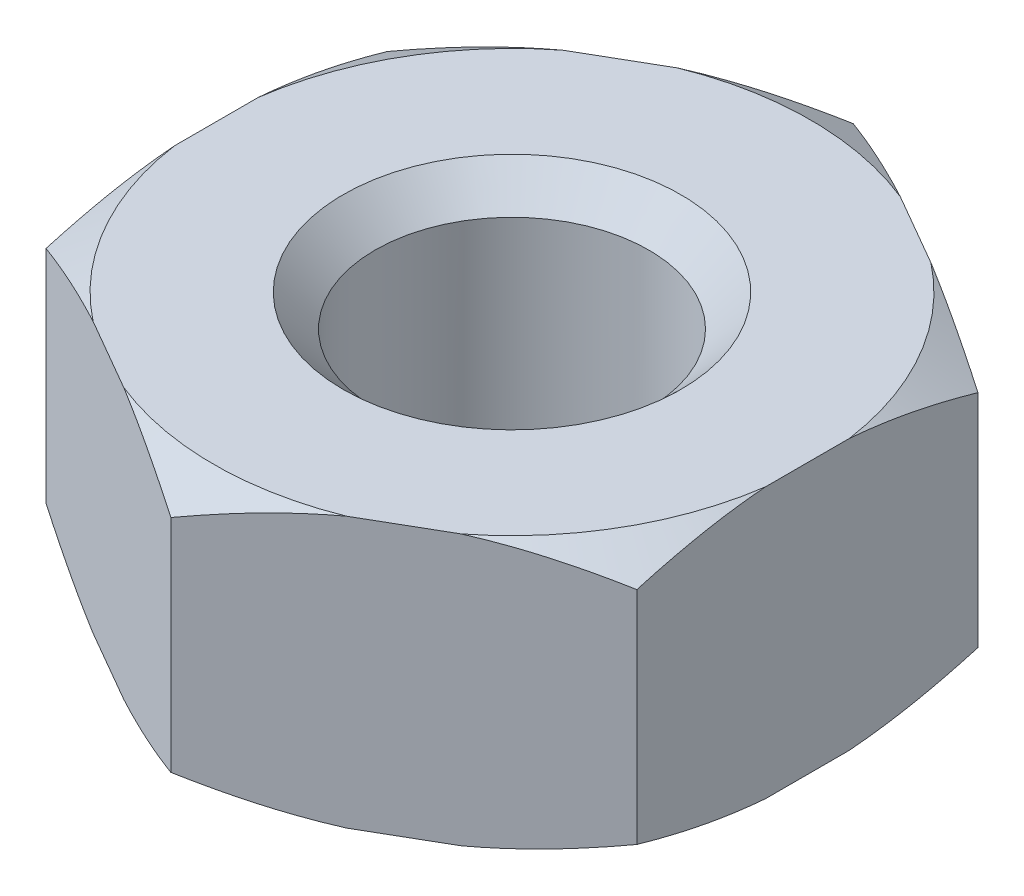
ISO-10303-21;
HEADER;
FILE_DESCRIPTION(('STEP AP214'),'2;1');
FILE_NAME('part.step','',(''),(''),'','','');
FILE_SCHEMA(('AUTOMOTIVE_DESIGN { 1 0 10303 214 1 1 1 1 }'));
ENDSEC;
DATA;
#1=APPLICATION_CONTEXT('core data for automotive mechanical design processes');
#2=APPLICATION_PROTOCOL_DEFINITION('international standard','automotive_design',2000,#1);
#3=PRODUCT_CONTEXT('',#1,'mechanical');
#4=PRODUCT('Part','Part','',(#3));
#5=PRODUCT_RELATED_PRODUCT_CATEGORY('part','',(#4));
#6=PRODUCT_DEFINITION_FORMATION('','',#4);
#7=PRODUCT_DEFINITION_CONTEXT('part definition',#1,'design');
#8=PRODUCT_DEFINITION('design','',#6,#7);
#9=PRODUCT_DEFINITION_SHAPE('','',#8);
#10=(LENGTH_UNIT() NAMED_UNIT(*) SI_UNIT(.MILLI.,.METRE.));
#11=(NAMED_UNIT(*) PLANE_ANGLE_UNIT() SI_UNIT($,.RADIAN.));
#12=(NAMED_UNIT(*) SI_UNIT($,.STERADIAN.) SOLID_ANGLE_UNIT());
#13=UNCERTAINTY_MEASURE_WITH_UNIT(LENGTH_MEASURE(1.E-05),#10,'distance_accuracy_value','');
#14=(GEOMETRIC_REPRESENTATION_CONTEXT(3) GLOBAL_UNCERTAINTY_ASSIGNED_CONTEXT((#13)) GLOBAL_UNIT_ASSIGNED_CONTEXT((#10,
#11,#12)) REPRESENTATION_CONTEXT('',''));
#15=CARTESIAN_POINT('',(0.,0.,0.));
#16=DIRECTION('',(0.,0.,1.));
#17=DIRECTION('',(1.,0.,0.));
#18=AXIS2_PLACEMENT_3D('',#15,#16,#17);
#19=CARTESIAN_POINT('',(14.9999999999998,89.594158762111,30.9807621135335));
#20=DIRECTION('',(0.,1.,0.));
#21=DIRECTION('',(0.,0.,1.));
#22=AXIS2_PLACEMENT_3D('',#19,#20,#21);
#23=CONICAL_SURFACE('',#22,4.04449792147054,1.04719755122789);
#24=CARTESIAN_POINT('',(14.9999996255523,89.5924002565624,26.9393100130187));
#25=CARTESIAN_POINT('',(15.1079034852909,89.5564400899679,27.0016083354854));
#26=CARTESIAN_POINT('',(15.2164124104834,89.5227578619408,27.0642559926547));
#27=CARTESIAN_POINT('',(15.4343175488654,89.4609646511426,27.1900635829574));
#28=CARTESIAN_POINT('',(15.5437108336706,89.432839830139,27.2532218253872));
#29=CARTESIAN_POINT('',(15.7636624980717,89.3829733342438,27.3802109780379));
#30=CARTESIAN_POINT('',(15.8742214410188,89.3612349075061,27.4440422135097));
#31=CARTESIAN_POINT('',(16.0965006385664,89.3249619438303,27.572375168049));
#32=CARTESIAN_POINT('',(16.208223122392,89.3104457571025,27.6368781741603));
#33=CARTESIAN_POINT('',(16.3202724710333,89.2999996732793,27.7015698957609));
#34=B_SPLINE_CURVE_WITH_KNOTS('',3,(#24,#25,#26,#27,#28,#29,#30,#31,#32,#33),.UNSPECIFIED.,.F.,
.F.,(4,2,2,2,4),(0.,0.389082876202713,0.777184356642125,1.16548288716278,1.55476302847786),.UNSPECIFIED.);
#35=CARTESIAN_POINT('',(14.9999998127762,89.5924001941544,26.9393101211125));
#36=VERTEX_POINT('',#35);
#37=CARTESIAN_POINT('',(16.3202728778975,89.2999996352051,27.7015701306641));
#38=VERTEX_POINT('',#37);
#39=EDGE_CURVE('E152',#36,#38,#34,.T.);
#40=ORIENTED_EDGE('',*,*,#39,.T.);
#41=CARTESIAN_POINT('',(14.9999999999998,89.2999995971309,30.9807621135335));
#42=DIRECTION('',(0.,1.,0.));
#43=DIRECTION('',(0.,0.,1.));
#44=AXIS2_PLACEMENT_3D('',#41,#42,#43);
#45=CIRCLE('',#44,3.53499930217615);
#46=CARTESIAN_POINT('',(13.6797271221022,89.2999996352051,27.7015701306641));
#47=VERTEX_POINT('',#46);
#48=EDGE_CURVE('E154',#47,#38,#45,.F.);
#49=ORIENTED_EDGE('',*,*,#48,.F.);
#50=CARTESIAN_POINT('',(13.6797275289663,89.2999996732793,27.701569895761));
#51=CARTESIAN_POINT('',(13.7917768715689,89.3104457565444,27.6368781776469));
#52=CARTESIAN_POINT('',(13.9034993493964,89.32496194227,27.5723751749986));
#53=CARTESIAN_POINT('',(14.1257785350938,89.3612349032082,27.444042227301));
#54=CARTESIAN_POINT('',(14.2363374721885,89.3829733282139,27.3802109952081));
#55=CARTESIAN_POINT('',(14.4562891250316,89.4328398200611,27.2532218492304));
#56=CARTESIAN_POINT('',(14.5656824041311,89.4609646387498,27.1900636100948));
#57=CARTESIAN_POINT('',(14.7835875311933,89.5227578444655,27.0642560263276));
#58=CARTESIAN_POINT('',(14.8920964507722,89.5564400697229,27.0016083723992));
#59=CARTESIAN_POINT('',(15.0000003049579,89.5924002333992,26.9393100531386));
#60=B_SPLINE_CURVE_WITH_KNOTS('',3,(#50,#51,#52,#53,#54,#55,#56,#57,#58,#59),.UNSPECIFIED.,.F.,
.F.,(4,2,2,2,4),(0.,0.389280120356007,0.777578630048175,1.16568008969993,1.55476294498455),.UNSPECIFIED.);
#61=EDGE_CURVE('E21',#47,#36,#60,.T.);
#62=ORIENTED_EDGE('',*,*,#61,.T.);
#63=EDGE_LOOP('',(#40,#49,#62));
#64=FACE_BOUND('',#63,.T.);
#65=ADVANCED_FACE('F17',(#64),#23,.T.);
#66=CARTESIAN_POINT('',(14.9999999999998,89.594158762111,30.9807621135335));
#67=DIRECTION('',(0.,1.,0.));
#68=DIRECTION('',(0.,0.,1.));
#69=AXIS2_PLACEMENT_3D('',#66,#67,#68);
#70=CONICAL_SURFACE('',#69,4.04449792147054,1.04719755122789);
#71=CARTESIAN_POINT('',(18.4999999999998,89.5924002565614,28.9600357389985));
#72=CARTESIAN_POINT('',(18.4999999999998,89.5564400897345,29.0846323847375));
#73=CARTESIAN_POINT('',(18.4999999999998,89.5227578615043,29.2099276998914));
#74=CARTESIAN_POINT('',(18.4999999999998,89.4609646503785,29.461542882137));
#75=CARTESIAN_POINT('',(18.4999999999998,89.43283982925,29.5878593678216));
#76=CARTESIAN_POINT('',(18.4999999999998,89.3829733331993,29.8418376747895));
#77=CARTESIAN_POINT('',(18.4999999999998,89.3612349064311,29.9695001465748));
#78=CARTESIAN_POINT('',(18.4999999999998,89.324961942802,30.2261660573509));
#79=CARTESIAN_POINT('',(18.4999999999998,89.3104457561519,30.3551720704295));
#80=CARTESIAN_POINT('',(18.4999999999998,89.2999996724683,30.4845555144862));
#81=B_SPLINE_CURVE_WITH_KNOTS('',3,(#71,#72,#73,#74,#75,#76,#77,#78,#79,#80),.UNSPECIFIED.,.F.,
.F.,(4,2,2,2,4),(0.,0.389082878719323,0.777184361653166,1.16548289467336,1.55476303851014),.UNSPECIFIED.);
#82=CARTESIAN_POINT('',(18.4999999999998,89.5924001941539,28.9600359551843));
#83=VERTEX_POINT('',#82);
#84=CARTESIAN_POINT('',(18.4999999999998,89.2999996347925,30.4845559793772));
#85=VERTEX_POINT('',#84);
#86=EDGE_CURVE('E415',#83,#85,#81,.T.);
#87=ORIENTED_EDGE('',*,*,#86,.T.);
#88=CARTESIAN_POINT('',(14.9999999999998,89.2999995971309,30.9807621135335));
#89=DIRECTION('',(0.,1.,0.));
#90=DIRECTION('',(0.,0.,1.));
#91=AXIS2_PLACEMENT_3D('',#88,#89,#90);
#92=CIRCLE('',#91,3.53499930217615);
#93=CARTESIAN_POINT('',(17.179727122102,89.2999996352051,28.1977762699117));
#94=VERTEX_POINT('',#93);
#95=EDGE_CURVE('E186',#94,#85,#92,.F.);
#96=ORIENTED_EDGE('',*,*,#95,.F.);
#97=CARTESIAN_POINT('',(17.1797275289663,89.2999996732793,28.1977765048149));
#98=CARTESIAN_POINT('',(17.2917768715691,89.3104457565445,28.2624682229292));
#99=CARTESIAN_POINT('',(17.403499349397,89.3249619422701,28.3269712255776));
#100=CARTESIAN_POINT('',(17.6257785350948,89.3612349032085,28.4553041732755));
#101=CARTESIAN_POINT('',(17.7363374721898,89.3829733282142,28.5191354053686));
#102=CARTESIAN_POINT('',(17.9562891250333,89.4328398200616,28.6461245513465));
#103=CARTESIAN_POINT('',(18.0656824041331,89.4609646387503,28.7092827904823));
#104=CARTESIAN_POINT('',(18.2835875311958,89.5227578444663,28.8350903742497));
#105=CARTESIAN_POINT('',(18.3920964507749,89.5564400697238,28.8977380281782));
#106=CARTESIAN_POINT('',(18.5000003049608,89.5924002334002,28.9600363474391));
#107=B_SPLINE_CURVE_WITH_KNOTS('',3,(#97,#98,#99,#100,#101,#102,#103,#104,#105,#106),
.UNSPECIFIED.,.F.,.F.,(4,2,2,2,4),(0.,0.3892801203569,0.77757863004996,1.16568008970261,
1.55476294498812),.UNSPECIFIED.);
#108=EDGE_CURVE('E420',#94,#83,#107,.T.);
#109=ORIENTED_EDGE('',*,*,#108,.T.);
#110=EDGE_LOOP('',(#87,#96,#109));
#111=FACE_BOUND('',#110,.T.);
#112=ADVANCED_FACE('F406',(#111),#70,.T.);
#113=CARTESIAN_POINT('',(14.9999999999998,89.5941587620541,30.9807621135335));
#114=DIRECTION('',(0.,1.,0.));
#115=DIRECTION('',(0.,0.,1.));
#116=AXIS2_PLACEMENT_3D('',#113,#114,#115);
#117=CONICAL_SURFACE('',#116,4.04449792138374,1.04719755117958);
#118=CARTESIAN_POINT('',(18.499999998484,89.2999996732925,31.476968712333));
#119=CARTESIAN_POINT('',(18.4999999994531,89.3104457420079,31.6063519764103));
#120=CARTESIAN_POINT('',(18.4999999998528,89.3249619025469,31.7353578106814));
#121=CARTESIAN_POINT('',(18.5000000001465,89.3612347953169,31.9920233681568));
#122=CARTESIAN_POINT('',(18.5000000000417,89.3829731774212,32.1196856654355));
#123=CARTESIAN_POINT('',(18.4999999999579,89.4328395689953,32.373663627768));
#124=CARTESIAN_POINT('',(18.4999999999788,89.4609643303312,32.4999799433193));
#125=CARTESIAN_POINT('',(18.5000000000208,89.5227574101921,32.7515947880351));
#126=CARTESIAN_POINT('',(18.5000000000419,89.5564395668933,32.8768899358091));
#127=CARTESIAN_POINT('',(18.4999999999998,89.5923996583918,33.0014864159717));
#128=B_SPLINE_CURVE_WITH_KNOTS('',3,(#118,#119,#120,#121,#122,#123,#124,#125,#126,#127),
.UNSPECIFIED.,.F.,.F.,(4,2,2,2,4),(0.,0.389279602662558,0.777577597854176,1.16567854397863,
1.55476088254271),.UNSPECIFIED.);
#129=CARTESIAN_POINT('',(18.4999999999998,89.2999996347443,31.4769682475828));
#130=VERTEX_POINT('',#129);
#131=CARTESIAN_POINT('',(18.5000000553264,89.5923999135079,33.0014872038917));
#132=VERTEX_POINT('',#131);
#133=EDGE_CURVE('E410',#130,#132,#128,.T.);
#134=ORIENTED_EDGE('',*,*,#133,.T.);
#135=CARTESIAN_POINT('',(17.1797275289671,89.2999996732398,33.7637477222515));
#136=CARTESIAN_POINT('',(17.2917768546849,89.3104457549461,33.6990560138858));
#137=CARTESIAN_POINT('',(17.4034993157409,89.3249619378708,33.6345530209206));
#138=CARTESIAN_POINT('',(17.6257784683034,89.3612348911584,33.5062200923534));
#139=CARTESIAN_POINT('',(17.7363373890334,89.3829733113233,33.4423888697086));
#140=CARTESIAN_POINT('',(17.9562890095579,89.4328397918575,33.3153997423901));
#141=CARTESIAN_POINT('',(18.065682272703,89.4609646040759,33.2522415124657));
#142=CARTESIAN_POINT('',(18.2835873681123,89.5227577955868,33.1264339469734));
#143=CARTESIAN_POINT('',(18.3920962719941,89.5564400131035,33.0637863021078));
#144=CARTESIAN_POINT('',(18.5000001106521,89.5924001686237,33.001487991812));
#145=B_SPLINE_CURVE_WITH_KNOTS('',3,(#135,#136,#137,#138,#139,#140,#141,#142,#143,#144),
.UNSPECIFIED.,.F.,.F.,(4,2,2,2,4),(0.,0.389280061751958,0.777578513204977,1.16567991473175,
1.55476271152684),.UNSPECIFIED.);
#146=CARTESIAN_POINT('',(17.1797271220103,89.2999996351569,33.7637479572081));
#147=VERTEX_POINT('',#146);
#148=EDGE_CURVE('E393',#147,#132,#145,.T.);
#149=ORIENTED_EDGE('',*,*,#148,.F.);
#150=CARTESIAN_POINT('',(14.9999999999998,89.299999597074,30.9807621135335));
#151=DIRECTION('',(0.,1.,0.));
#152=DIRECTION('',(0.,0.,1.));
#153=AXIS2_PLACEMENT_3D('',#150,#151,#152);
#154=CIRCLE('',#153,3.53499930214619);
#155=EDGE_CURVE('E184',#130,#147,#154,.F.);
#156=ORIENTED_EDGE('',*,*,#155,.F.);
#157=EDGE_LOOP('',(#134,#149,#156));
#158=FACE_BOUND('',#157,.T.);
#159=ADVANCED_FACE('F403',(#158),#117,.T.);
#160=CARTESIAN_POINT('',(14.9999999999998,89.5941587620541,30.9807621135335));
#161=DIRECTION('',(0.,1.,0.));
#162=DIRECTION('',(0.,0.,1.));
#163=AXIS2_PLACEMENT_3D('',#160,#161,#162);
#164=CONICAL_SURFACE('',#163,4.04449792138374,1.04719755117958);
#165=CARTESIAN_POINT('',(14.9999994151093,89.5923999367761,35.0222136601742));
#166=CARTESIAN_POINT('',(14.8920956313348,89.5564398102326,34.9599153815654));
#167=CARTESIAN_POINT('',(14.7835867829349,89.522757620235,34.8972677687323));
#168=CARTESIAN_POINT('',(14.5656817994087,89.4609644792686,34.7714602678356));
#169=CARTESIAN_POINT('',(14.456288592659,89.4328396900974,34.7083020704712));
#170=CARTESIAN_POINT('',(14.2363370863788,89.3829732499244,34.5813130091117));
#171=CARTESIAN_POINT('',(14.1257782234992,89.3612348470655,34.5174818198668));
#172=CARTESIAN_POINT('',(13.9034991880782,89.3249619212263,34.3891489589313));
#173=CARTESIAN_POINT('',(13.7917767863178,89.3104457484111,34.3246460002004));
#174=CARTESIAN_POINT('',(13.6797275203016,89.2999996724289,34.2599543263035));
#175=B_SPLINE_CURVE_WITH_KNOTS('',3,(#165,#166,#167,#168,#169,#170,#171,#172,#173,#174),
.UNSPECIFIED.,.F.,.F.,(4,2,2,2,4),(0.,0.389082589936093,0.777183785887369,1.16548203136116,
1.55476188584912),.UNSPECIFIED.);
#176=CARTESIAN_POINT('',(14.9999999999998,89.5923999367763,35.0222136601745));
#177=VERTEX_POINT('',#176);
#178=CARTESIAN_POINT('',(13.6797271176003,89.2999996347443,34.2599540938037));
#179=VERTEX_POINT('',#178);
#180=EDGE_CURVE('E283',#177,#179,#175,.T.);
#181=ORIENTED_EDGE('',*,*,#180,.T.);
#182=CARTESIAN_POINT('',(14.9999999999998,89.299999597074,30.9807621135335));
#183=DIRECTION('',(0.,1.,0.));
#184=DIRECTION('',(0.,0.,1.));
#185=AXIS2_PLACEMENT_3D('',#182,#183,#184);
#186=CIRCLE('',#185,3.53499930214619);
#187=CARTESIAN_POINT('',(16.320272877989,89.2999996351569,34.25995409635));
#188=VERTEX_POINT('',#187);
#189=EDGE_CURVE('E183',#188,#179,#186,.F.);
#190=ORIENTED_EDGE('',*,*,#189,.F.);
#191=CARTESIAN_POINT('',(15.0000005848903,89.5923999367761,35.0222136601741));
#192=CARTESIAN_POINT('',(15.1079043679669,89.5564398104651,34.9599153819683));
#193=CARTESIAN_POINT('',(15.2164132156606,89.5227576206707,34.8972677695429));
#194=CARTESIAN_POINT('',(15.4343181977659,89.4609644800321,34.7714602694666));
#195=CARTESIAN_POINT('',(15.5437114038008,89.4328396909859,34.7083020725148));
#196=CARTESIAN_POINT('',(15.7636629086374,89.3829732509685,34.5813130119888));
#197=CARTESIAN_POINT('',(15.874221770788,89.3612348481402,34.5174818231648));
#198=CARTESIAN_POINT('',(16.0965008047384,89.3249619222543,34.3891489630783));
#199=CARTESIAN_POINT('',(16.2082232057573,89.3104457493615,34.3246460047756));
#200=CARTESIAN_POINT('',(16.3202724710323,89.2999996732398,34.2599543313066));
#201=B_SPLINE_CURVE_WITH_KNOTS('',3,(#191,#192,#193,#194,#195,#196,#197,#198,#199,#200),
.UNSPECIFIED.,.F.,.F.,(4,2,2,2,4),(0.,0.389082587418711,0.777183780874786,1.16548202384827,
1.55476187581376),.UNSPECIFIED.);
#202=EDGE_CURVE('E399',#177,#188,#201,.T.);
#203=ORIENTED_EDGE('',*,*,#202,.F.);
#204=EDGE_LOOP('',(#181,#190,#203));
#205=FACE_BOUND('',#204,.T.);
#206=ADVANCED_FACE('F266',(#205),#164,.T.);
#207=CARTESIAN_POINT('',(14.9999999999998,89.5941587620541,30.9807621135335));
#208=DIRECTION('',(0.,1.,0.));
#209=DIRECTION('',(0.,0.,1.));
#210=AXIS2_PLACEMENT_3D('',#207,#208,#209);
#211=CONICAL_SURFACE('',#210,4.04449792138374,1.04719755117958);
#212=CARTESIAN_POINT('',(11.4999999999998,89.5924002565429,33.0014884880285));
#213=CARTESIAN_POINT('',(11.4999999999998,89.5564400899462,32.8768918430991));
#214=CARTESIAN_POINT('',(11.4999999999998,89.5227578619169,32.7515965287643));
#215=CARTESIAN_POINT('',(11.4999999999998,89.4609646511146,32.4999813481665));
#216=CARTESIAN_POINT('',(11.4999999999998,89.432839830109,32.3736648633106));
#217=CARTESIAN_POINT('',(11.4999999999998,89.3829733342105,32.1196865580164));
#218=CARTESIAN_POINT('',(11.4999999999998,89.3612349074712,31.9920240870762));
#219=CARTESIAN_POINT('',(11.4999999999998,89.3249619437927,31.7353581780044));
#220=CARTESIAN_POINT('',(11.4999999999998,89.3104457570637,31.6063521657852));
#221=CARTESIAN_POINT('',(11.4999999999998,89.2999996732397,31.4769687225873));
#222=B_SPLINE_CURVE_WITH_KNOTS('',3,(#212,#213,#214,#215,#216,#217,#218,#219,#220,#221),
.UNSPECIFIED.,.F.,.F.,(4,2,2,2,4),(0.,0.389082876193206,0.777184356622985,1.16548288713404,
1.55476302843963),.UNSPECIFIED.);
#223=CARTESIAN_POINT('',(11.4999999999998,89.5924001941412,33.0014882718627));
#224=VERTEX_POINT('',#223);
#225=CARTESIAN_POINT('',(11.4999999999998,89.2999996351569,31.4769682526744));
#226=VERTEX_POINT('',#225);
#227=EDGE_CURVE('E271',#224,#226,#222,.T.);
#228=ORIENTED_EDGE('',*,*,#227,.T.);
#229=CARTESIAN_POINT('',(14.9999999999998,89.299999597074,30.9807621135335));
#230=DIRECTION('',(0.,1.,0.));
#231=DIRECTION('',(0.,0.,1.));
#232=AXIS2_PLACEMENT_3D('',#229,#230,#231);
#233=CIRCLE('',#232,3.53499930214619);
#234=CARTESIAN_POINT('',(12.8202728823993,89.2999996347443,33.7637479597543));
#235=VERTEX_POINT('',#234);
#236=EDGE_CURVE('E179',#235,#226,#233,.F.);
#237=ORIENTED_EDGE('',*,*,#236,.F.);
#238=CARTESIAN_POINT('',(12.8202724806718,89.2999996732925,33.7637477260665));
#239=CARTESIAN_POINT('',(12.7082231367733,89.3104457558578,33.6990560083232));
#240=CARTESIAN_POINT('',(12.5965006579661,89.3249619412759,33.6345530055708));
#241=CARTESIAN_POINT('',(12.3742214706108,89.3612349020022,33.5062200572551));
#242=CARTESIAN_POINT('',(12.2636625328371,89.3829733271015,33.4423888246492));
#243=CARTESIAN_POINT('',(12.0437108785909,89.4328398191574,33.3153996777647));
#244=CARTESIAN_POINT('',(11.9343175987672,89.4609646379603,33.2522414382351));
#245=CARTESIAN_POINT('',(11.7164124702588,89.5227578439847,33.1264338536815));
#246=CARTESIAN_POINT('',(11.6079035499581,89.5564400694373,33.0637861993607));
#247=CARTESIAN_POINT('',(11.4999996950941,89.5924002333748,33.0014878796598));
#248=B_SPLINE_CURVE_WITH_KNOTS('',3,(#238,#239,#240,#241,#242,#243,#244,#245,#246,#247),
.UNSPECIFIED.,.F.,.F.,(4,2,2,2,4),(0.,0.389280122933855,0.777578635155598,1.16568009729628,
1.55476295511462),.UNSPECIFIED.);
#249=EDGE_CURVE('E276',#235,#224,#248,.T.);
#250=ORIENTED_EDGE('',*,*,#249,.T.);
#251=EDGE_LOOP('',(#228,#237,#250));
#252=FACE_BOUND('',#251,.T.);
#253=ADVANCED_FACE('F258',(#252),#211,.T.);
#254=CARTESIAN_POINT('',(14.9999999999998,89.594158762111,30.9807621135335));
#255=DIRECTION('',(0.,1.,0.));
#256=DIRECTION('',(0.,0.,1.));
#257=AXIS2_PLACEMENT_3D('',#254,#255,#256);
#258=CONICAL_SURFACE('',#257,4.04449792147054,1.04719755122789);
#259=CARTESIAN_POINT('',(11.4999999999998,89.2999996732793,30.4845555044795));
#260=CARTESIAN_POINT('',(11.4999999999998,89.3104457565443,30.3551720682534));
#261=CARTESIAN_POINT('',(11.4999999999998,89.3249619422695,30.2261660629591));
#262=CARTESIAN_POINT('',(11.4999999999998,89.3612349032069,29.9695001675682));
#263=CARTESIAN_POINT('',(11.4999999999998,89.382973328212,29.8418377033845));
#264=CARTESIAN_POINT('',(11.4999999999998,89.4328398200579,29.5878594114334));
#265=CARTESIAN_POINT('',(11.4999999999998,89.4609646387458,29.4615429331642));
#266=CARTESIAN_POINT('',(11.4999999999998,89.5227578444599,29.2099277656341));
#267=CARTESIAN_POINT('',(11.4999999999998,89.5564400697165,29.0846324577794));
#268=CARTESIAN_POINT('',(11.4999999999998,89.5924002333919,28.9600358192601));
#269=B_SPLINE_CURVE_WITH_KNOTS('',3,(#259,#260,#261,#262,#263,#264,#265,#266,#267,#268),
.UNSPECIFIED.,.F.,.F.,(4,2,2,2,4),(0.,0.389280120349326,0.777578630034866,1.16568008968,
1.55476294495795),.UNSPECIFIED.);
#270=CARTESIAN_POINT('',(11.4999999999998,89.2999996352051,30.4845559742858));
#271=VERTEX_POINT('',#270);
#272=CARTESIAN_POINT('',(11.4999998127906,89.5924001941496,28.9600362794551));
#273=VERTEX_POINT('',#272);
#274=EDGE_CURVE('E242',#271,#273,#269,.T.);
#275=ORIENTED_EDGE('',*,*,#274,.T.);
#276=CARTESIAN_POINT('',(11.4999996255812,89.5924002565527,28.9600363875406));
#277=CARTESIAN_POINT('',(11.6079034853174,89.5564400899595,28.8977380650752));
#278=CARTESIAN_POINT('',(11.7164124105076,89.5227578619335,28.8350904079072));
#279=CARTESIAN_POINT('',(11.9343175488849,89.4609646511374,28.7092828176073));
#280=CARTESIAN_POINT('',(12.0437108336877,89.4328398301347,28.6461245751788));
#281=CARTESIAN_POINT('',(12.263662498084,89.3829733342412,28.5191354225309));
#282=CARTESIAN_POINT('',(12.3742214410287,89.3612349075043,28.4553041870605));
#283=CARTESIAN_POINT('',(12.5965006385713,89.3249619438295,28.326971232524));
#284=CARTESIAN_POINT('',(12.7082231223945,89.3104457571022,28.2624682264141));
#285=CARTESIAN_POINT('',(12.8202724710332,89.2999996732793,28.1977765048151));
#286=B_SPLINE_CURVE_WITH_KNOTS('',3,(#276,#277,#278,#279,#280,#281,#282,#283,#284,#285),
.UNSPECIFIED.,.F.,.F.,(4,2,2,2,4),(0.,0.38908287619402,0.777184356624805,1.16548288713682,
1.55476302844319),.UNSPECIFIED.);
#287=CARTESIAN_POINT('',(12.8202728778974,89.2999996352051,28.1977762699119));
#288=VERTEX_POINT('',#287);
#289=EDGE_CURVE('E234',#273,#288,#286,.T.);
#290=ORIENTED_EDGE('',*,*,#289,.T.);
#291=CARTESIAN_POINT('',(14.9999999999998,89.2999995971309,30.9807621135335));
#292=DIRECTION('',(0.,1.,0.));
#293=DIRECTION('',(0.,0.,1.));
#294=AXIS2_PLACEMENT_3D('',#291,#292,#293);
#295=CIRCLE('',#294,3.53499930217615);
#296=EDGE_CURVE('E166',#271,#288,#295,.F.);
#297=ORIENTED_EDGE('',*,*,#296,.F.);
#298=EDGE_LOOP('',(#275,#290,#297));
#299=FACE_BOUND('',#298,.T.);
#300=ADVANCED_FACE('F253',(#299),#258,.T.);
#301=CARTESIAN_POINT('',(18.5349999999998,92.540414518845,32.9812807962755));
#302=DIRECTION('',(0.5,0.,0.866025403784439));
#303=DIRECTION('',(0.866025403784439,0.,-0.5));
#304=AXIS2_PLACEMENT_3D('',#301,#302,#303);
#305=PLANE('',#304);
#306=CARTESIAN_POINT('',(18.4999981130779,92.2076004972439,33.001489145112));
#307=CARTESIAN_POINT('',(18.3920944333498,92.2435605691086,33.0637873636496));
#308=CARTESIAN_POINT('',(18.2835856901324,92.2772427072112,33.1264349157555));
#309=CARTESIAN_POINT('',(18.0656809187072,92.3390357529464,33.2522422941956));
#310=CARTESIAN_POINT('',(17.9562878188658,92.3671604987402,33.3154004298366));
#311=CARTESIAN_POINT('',(17.7363365291495,92.4170268630672,33.4423893661628));
#312=CARTESIAN_POINT('',(17.6257777759285,92.4387652334726,33.5062204920962));
#313=CARTESIAN_POINT('',(17.4034989625452,92.4750381080168,33.6345532248383));
#314=CARTESIAN_POINT('',(17.2917766731721,92.4895542620527,33.6990561186823));
#315=CARTESIAN_POINT('',(17.1797275203028,92.5000003275807,33.7637477272539));
#316=B_SPLINE_CURVE_WITH_KNOTS('',3,(#306,#307,#308,#309,#310,#311,#312,#313,#314,#315),
.UNSPECIFIED.,.F.,.F.,(4,2,2,2,4),(0.,0.38908219799076,0.777183004440866,1.16548085964814,
1.55476032142311),.UNSPECIFIED.);
#317=CARTESIAN_POINT('',(18.4999990565398,92.2076001827567,33.001488600404));
#318=VERTEX_POINT('',#317);
#319=CARTESIAN_POINT('',(17.1797254891048,92.5000005176591,33.7637488999665));
#320=VERTEX_POINT('',#319);
#321=EDGE_CURVE('E188',#318,#320,#316,.T.);
#322=ORIENTED_EDGE('',*,*,#321,.T.);
#323=DIRECTION('',(0.866025403784439,0.,-0.5));
#324=VECTOR('',#323,1.);
#325=CARTESIAN_POINT('',(18.5349999999998,92.5000006323826,32.9812807962755));
#326=LINE('',#325,#324);
#327=CARTESIAN_POINT('',(16.3202728823985,92.5000003652654,34.2599540938042));
#328=VERTEX_POINT('',#327);
#329=EDGE_CURVE('E160',#320,#328,#326,.F.);
#330=ORIENTED_EDGE('',*,*,#329,.T.);
#331=CARTESIAN_POINT('',(16.3202724791555,92.5000003267184,34.2599543248688));
#332=CARTESIAN_POINT('',(16.2082233266958,92.4895542617508,34.3246459343213));
#333=CARTESIAN_POINT('',(16.0965010374799,92.4750381079452,34.3891488285355));
#334=CARTESIAN_POINT('',(15.874222224194,92.4387652335682,34.5174815615598));
#335=CARTESIAN_POINT('',(15.763663470914,92.417026863101,34.5813126874065));
#336=CARTESIAN_POINT('',(15.5437121811457,92.3671604987236,34.7083016236663));
#337=CARTESIAN_POINT('',(15.4343190813112,92.3390357529419,34.7714597593273));
#338=CARTESIAN_POINT('',(15.2164143098935,92.2772427072286,34.8972671378114));
#339=CARTESIAN_POINT('',(15.1079055666769,92.2435605691358,34.9599146899413));
#340=CARTESIAN_POINT('',(15.0000018869217,92.2076004972439,35.022212908446));
#341=B_SPLINE_CURVE_WITH_KNOTS('',3,(#331,#332,#333,#334,#335,#336,#337,#338,#339,#340),
.UNSPECIFIED.,.F.,.F.,(4,2,2,2,4),(0.,0.389279461844505,0.777577317095368,1.16567812355356,
1.55476032157491),.UNSPECIFIED.);
#342=CARTESIAN_POINT('',(14.9999999999998,92.2076004972432,35.022212908447));
#343=VERTEX_POINT('',#342);
#344=EDGE_CURVE('E241',#328,#343,#341,.T.);
#345=ORIENTED_EDGE('',*,*,#344,.T.);
#346=DIRECTION('',(0.,1.,0.));
#347=VECTOR('',#346,1.);
#348=CARTESIAN_POINT('',(14.9999999999998,92.540414518845,35.0222139978608));
#349=LINE('',#348,#347);
#350=EDGE_CURVE('E317',#177,#343,#349,.T.);
#351=ORIENTED_EDGE('',*,*,#350,.F.);
#352=ORIENTED_EDGE('',*,*,#202,.T.);
#353=DIRECTION('',(-0.866025403784467,0.,0.499999999999951));
#354=VECTOR('',#353,1.);
#355=CARTESIAN_POINT('',(17.1797275326647,89.3000000000017,33.7637477201167));
#356=LINE('',#355,#354);
#357=EDGE_CURVE('E180',#147,#188,#356,.T.);
#358=ORIENTED_EDGE('',*,*,#357,.F.);
#359=ORIENTED_EDGE('',*,*,#148,.T.);
#360=DIRECTION('',(0.,-1.,0.));
#361=VECTOR('',#360,1.);
#362=CARTESIAN_POINT('',(18.4999999999998,92.5404145188449,33.0014880556971));
#363=LINE('',#362,#361);
#364=EDGE_CURVE('E170',#318,#132,#363,.T.);
#365=ORIENTED_EDGE('',*,*,#364,.F.);
#366=EDGE_LOOP('',(#322,#330,#345,#351,#352,#358,#359,#365));
#367=FACE_BOUND('',#366,.T.);
#368=ADVANCED_FACE('F257',(#367),#305,.T.);
#369=CARTESIAN_POINT('',(11.4191709623132,89.3000000000017,35.1030430355474));
#370=DIRECTION('',(0.,-1.,0.));
#371=DIRECTION('',(0.,0.,-1.));
#372=AXIS2_PLACEMENT_3D('',#369,#370,#371);
#373=PLANE('',#372);
#374=ORIENTED_EDGE('',*,*,#296,.T.);
#375=DIRECTION('',(0.86602540378444,0.,-0.499999999999998));
#376=VECTOR('',#375,1.);
#377=CARTESIAN_POINT('',(12.8202724673348,89.3000000000017,28.1977765069503));
#378=LINE('',#377,#376);
#379=EDGE_CURVE('E147',#288,#47,#378,.T.);
#380=ORIENTED_EDGE('',*,*,#379,.T.);
#381=ORIENTED_EDGE('',*,*,#48,.T.);
#382=DIRECTION('',(0.866025403784442,0.,0.499999999999995));
#383=VECTOR('',#382,1.);
#384=CARTESIAN_POINT('',(16.3202724673348,89.3000000000017,27.7015698936256));
#385=LINE('',#384,#383);
#386=EDGE_CURVE('E159',#38,#94,#385,.T.);
#387=ORIENTED_EDGE('',*,*,#386,.T.);
#388=ORIENTED_EDGE('',*,*,#95,.T.);
#389=DIRECTION('',(0.,0.,-1.));
#390=VECTOR('',#389,1.);
#391=CARTESIAN_POINT('',(18.4999999999998,89.2999993676207,28.9196216525265));
#392=LINE('',#391,#390);
#393=EDGE_CURVE('E176',#130,#85,#392,.T.);
#394=ORIENTED_EDGE('',*,*,#393,.F.);
#395=ORIENTED_EDGE('',*,*,#155,.T.);
#396=ORIENTED_EDGE('',*,*,#357,.T.);
#397=ORIENTED_EDGE('',*,*,#189,.T.);
#398=DIRECTION('',(0.866025403784439,0.,0.499999999999999));
#399=VECTOR('',#398,1.);
#400=CARTESIAN_POINT('',(15.0349999999998,89.2999993676207,35.0424212572825));
#401=LINE('',#400,#399);
#402=EDGE_CURVE('E315',#235,#179,#401,.T.);
#403=ORIENTED_EDGE('',*,*,#402,.F.);
#404=ORIENTED_EDGE('',*,*,#236,.T.);
#405=DIRECTION('',(0.,0.,-1.));
#406=VECTOR('',#405,1.);
#407=CARTESIAN_POINT('',(11.4999999999998,89.3000000000017,35.1030430355474));
#408=LINE('',#407,#406);
#409=EDGE_CURVE('E172',#226,#271,#408,.T.);
#410=ORIENTED_EDGE('',*,*,#409,.T.);
#411=EDGE_LOOP('',(#374,#380,#381,#387,#388,#394,#395,#396,#397,#403,#404,#410));
#412=FACE_BOUND('',#411,.T.);
#413=CARTESIAN_POINT('',(14.9999999999998,89.2999999999802,30.9807621135335));
#414=DIRECTION('',(0.,-1.,0.));
#415=DIRECTION('',(0.,0.,-1.));
#416=AXIS2_PLACEMENT_3D('',#413,#414,#415);
#417=CIRCLE('',#416,1.99999999999611);
#418=CARTESIAN_POINT('',(14.9999999999998,89.2999999999802,28.9807621135374));
#419=VERTEX_POINT('',#418);
#420=EDGE_CURVE('E373',#419,#419,#417,.F.);
#421=ORIENTED_EDGE('',*,*,#420,.T.);
#422=EDGE_LOOP('',(#421));
#423=FACE_BOUND('',#422,.T.);
#424=ADVANCED_FACE('F162',(#412,#423),#373,.T.);
#425=CARTESIAN_POINT('',(18.4999999999998,92.5404145188449,28.9196216525265));
#426=DIRECTION('',(1.,0.,0.));
#427=DIRECTION('',(0.,0.,-1.));
#428=AXIS2_PLACEMENT_3D('',#425,#426,#427);
#429=PLANE('',#428);
#430=CARTESIAN_POINT('',(18.4999999999998,92.2076004972374,28.9600383502014));
#431=CARTESIAN_POINT('',(18.4999999999998,92.2435605690983,29.084634787277));
#432=CARTESIAN_POINT('',(18.4999999999998,92.2772427071972,29.2099298914895));
#433=CARTESIAN_POINT('',(18.4999999999998,92.3390357529257,29.4615446483702));
#434=CARTESIAN_POINT('',(18.4999999999998,92.3671604987163,29.5878609196524));
#435=CARTESIAN_POINT('',(18.4999999999998,92.4170268630376,29.8418387923051));
#436=CARTESIAN_POINT('',(18.4999999999998,92.4387652334404,29.9695010441719));
#437=CARTESIAN_POINT('',(18.4999999999998,92.4750381079805,30.2261665096556));
#438=CARTESIAN_POINT('',(18.4999999999998,92.4895542620146,30.3551722973433));
#439=CARTESIAN_POINT('',(18.4999999999998,92.5000003275414,30.4845555144859));
#440=B_SPLINE_CURVE_WITH_KNOTS('',3,(#430,#431,#432,#433,#434,#435,#436,#437,#438,#439),
.UNSPECIFIED.,.F.,.F.,(4,2,2,2,4),(0.,0.389082197989208,0.777183004437975,1.16548085964386,
1.55476032141723),.UNSPECIFIED.);
#441=CARTESIAN_POINT('',(18.4999999999998,92.20760018275,28.9600372607845));
#442=VERTEX_POINT('',#441);
#443=CARTESIAN_POINT('',(18.4999999999998,92.5000005176307,30.4845578600456));
#444=VERTEX_POINT('',#443);
#445=EDGE_CURVE('E318',#442,#444,#440,.T.);
#446=ORIENTED_EDGE('',*,*,#445,.T.);
#447=DIRECTION('',(0.,0.,-1.));
#448=VECTOR('',#447,1.);
#449=CARTESIAN_POINT('',(18.4999999999998,92.5000006323825,28.9196216525265));
#450=LINE('',#449,#448);
#451=CARTESIAN_POINT('',(18.4999999999998,92.5000003652654,31.4769682475837));
#452=VERTEX_POINT('',#451);
#453=EDGE_CURVE('E316',#444,#452,#450,.F.);
#454=ORIENTED_EDGE('',*,*,#453,.T.);
#455=CARTESIAN_POINT('',(18.4999999984861,92.5000003267183,31.4769687123348));
#456=CARTESIAN_POINT('',(18.4999999994538,92.4895542617508,31.6063519295636));
#457=CARTESIAN_POINT('',(18.499999999853,92.4750381079452,31.7353577173007));
#458=CARTESIAN_POINT('',(18.5000000001463,92.4387652335682,31.9920231828415));
#459=CARTESIAN_POINT('',(18.5000000000416,92.417026863101,32.1196854347161));
#460=CARTESIAN_POINT('',(18.499999999958,92.3671604987236,32.3736633073804));
#461=CARTESIAN_POINT('',(18.4999999999789,92.3390357529419,32.4999795786664));
#462=CARTESIAN_POINT('',(18.5000000000208,92.2772427072286,32.7515943355619));
#463=CARTESIAN_POINT('',(18.5000000000418,92.2435605691358,32.8768894397852));
#464=CARTESIAN_POINT('',(18.4999999999998,92.2076004972439,33.0014858768674));
#465=B_SPLINE_CURVE_WITH_KNOTS('',3,(#455,#456,#457,#458,#459,#460,#461,#462,#463,#464),
.UNSPECIFIED.,.F.,.F.,(4,2,2,2,4),(0.,0.38927946184448,0.777577317095342,1.16567812355352,
1.55476032157486),.UNSPECIFIED.);
#466=EDGE_CURVE('E167',#452,#318,#465,.T.);
#467=ORIENTED_EDGE('',*,*,#466,.T.);
#468=ORIENTED_EDGE('',*,*,#364,.T.);
#469=ORIENTED_EDGE('',*,*,#133,.F.);
#470=ORIENTED_EDGE('',*,*,#393,.T.);
#471=ORIENTED_EDGE('',*,*,#86,.F.);
#472=DIRECTION('',(0.,-1.,0.));
#473=VECTOR('',#472,1.);
#474=CARTESIAN_POINT('',(18.4999999999998,92.5404145188449,28.9600361713697));
#475=LINE('',#474,#473);
#476=EDGE_CURVE('E365',#442,#83,#475,.T.);
#477=ORIENTED_EDGE('',*,*,#476,.F.);
#478=EDGE_LOOP('',(#446,#454,#467,#468,#469,#470,#471,#477));
#479=FACE_BOUND('',#478,.T.);
#480=ADVANCED_FACE('F294',(#479),#429,.T.);
#481=CARTESIAN_POINT('',(15.0349999999998,92.540414518845,35.0424212572825));
#482=DIRECTION('',(-0.499999999999999,0.,0.866025403784439));
#483=DIRECTION('',(0.866025403784439,0.,0.499999999999999));
#484=AXIS2_PLACEMENT_3D('',#481,#482,#483);
#485=PLANE('',#484);
#486=CARTESIAN_POINT('',(14.9999981130779,92.2076004972439,35.022212908446));
#487=CARTESIAN_POINT('',(14.8920944333498,92.2435605691086,34.9599146899084));
#488=CARTESIAN_POINT('',(14.7835856901324,92.2772427072112,34.8972671378024));
#489=CARTESIAN_POINT('',(14.5656809187072,92.3390357529464,34.7714597593624));
#490=CARTESIAN_POINT('',(14.4562878188658,92.3671604987402,34.7083016237214));
#491=CARTESIAN_POINT('',(14.2363365291495,92.4170268630672,34.5813126873952));
#492=CARTESIAN_POINT('',(14.1257777759285,92.4387652334726,34.5174815614618));
#493=CARTESIAN_POINT('',(13.9034989625452,92.4750381080168,34.3891488287197));
#494=CARTESIAN_POINT('',(13.7917766731721,92.4895542620527,34.3246459348757));
#495=CARTESIAN_POINT('',(13.6797275203028,92.5000003275807,34.2599543263042));
#496=B_SPLINE_CURVE_WITH_KNOTS('',3,(#486,#487,#488,#489,#490,#491,#492,#493,#494,#495),
.UNSPECIFIED.,.F.,.F.,(4,2,2,2,4),(0.,0.389082197990737,0.777183004440823,1.16548085964808,
1.55476032142302),.UNSPECIFIED.);
#497=CARTESIAN_POINT('',(13.6797254891047,92.5000005176591,34.2599531535914));
#498=VERTEX_POINT('',#497);
#499=EDGE_CURVE('E301',#343,#498,#496,.T.);
#500=ORIENTED_EDGE('',*,*,#499,.T.);
#501=DIRECTION('',(0.866025403784439,0.,0.499999999999999));
#502=VECTOR('',#501,1.);
#503=CARTESIAN_POINT('',(15.0349999999998,92.5000006323826,35.0424212572825));
#504=LINE('',#503,#502);
#505=CARTESIAN_POINT('',(12.8202728823986,92.5000003652654,33.7637479597539));
#506=VERTEX_POINT('',#505);
#507=EDGE_CURVE('E476',#498,#506,#504,.F.);
#508=ORIENTED_EDGE('',*,*,#507,.T.);
#509=CARTESIAN_POINT('',(12.8202724806692,92.5000003267183,33.7637477260675));
#510=CARTESIAN_POINT('',(12.7082233272418,92.4895542617508,33.6990561182911));
#511=CARTESIAN_POINT('',(12.5965010376267,92.4750381079452,33.6345532247682));
#512=CARTESIAN_POINT('',(12.3742222240476,92.4387652335682,33.5062204922518));
#513=CARTESIAN_POINT('',(12.2636634708722,92.417026863101,33.4423893662239));
#514=CARTESIAN_POINT('',(12.0437121811876,92.3671604987236,33.3154004298193));
#515=CARTESIAN_POINT('',(11.9343190813321,92.3390357529419,33.2522422941944));
#516=CARTESIAN_POINT('',(11.7164143098726,92.2772427072286,33.126434915783));
#517=CARTESIAN_POINT('',(11.6079055666349,92.2435605691357,33.0637873636896));
#518=CARTESIAN_POINT('',(11.5000018869217,92.2076004972439,33.0014891451121));
#519=B_SPLINE_CURVE_WITH_KNOTS('',3,(#509,#510,#511,#512,#513,#514,#515,#516,#517,#518),
.UNSPECIFIED.,.F.,.F.,(4,2,2,2,4),(0.,0.389279461844491,0.777577317095357,1.16567812355355,
1.55476032157488),.UNSPECIFIED.);
#520=CARTESIAN_POINT('',(11.5000009434598,92.2076004972432,33.0014875109903));
#521=VERTEX_POINT('',#520);
#522=EDGE_CURVE('E309',#506,#521,#519,.T.);
#523=ORIENTED_EDGE('',*,*,#522,.T.);
#524=DIRECTION('',(0.,1.,0.));
#525=VECTOR('',#524,1.);
#526=CARTESIAN_POINT('',(11.4999999999998,92.540414518845,33.0014880556972));
#527=LINE('',#526,#525);
#528=EDGE_CURVE('E342',#224,#521,#527,.T.);
#529=ORIENTED_EDGE('',*,*,#528,.F.);
#530=ORIENTED_EDGE('',*,*,#249,.F.);
#531=ORIENTED_EDGE('',*,*,#402,.T.);
#532=ORIENTED_EDGE('',*,*,#180,.F.);
#533=ORIENTED_EDGE('',*,*,#350,.T.);
#534=EDGE_LOOP('',(#500,#508,#523,#529,#530,#531,#532,#533));
#535=FACE_BOUND('',#534,.T.);
#536=ADVANCED_FACE('F288',(#535),#485,.T.);
#537=CARTESIAN_POINT('',(14.9999999999998,89.300000000037,30.9807621135335));
#538=DIRECTION('',(0.,-1.,0.));
#539=DIRECTION('',(0.,0.,-1.));
#540=AXIS2_PLACEMENT_3D('',#537,#538,#539);
#541=CONICAL_SURFACE('',#540,1.99999999993926,0.785398163397448);
#542=ORIENTED_EDGE('',*,*,#420,.F.);
#543=EDGE_LOOP('',(#542));
#544=FACE_BOUND('',#543,.T.);
#545=CARTESIAN_POINT('',(14.9999999999998,89.6788400000016,30.9807621135334));
#546=DIRECTION('',(0.,1.,0.));
#547=DIRECTION('',(0.,0.,1.));
#548=AXIS2_PLACEMENT_3D('',#545,#546,#547);
#549=CIRCLE('',#548,1.62116);
#550=CARTESIAN_POINT('',(14.9999999999998,89.6788400000016,32.6019221135334));
#551=VERTEX_POINT('',#550);
#552=EDGE_CURVE('E472',#551,#551,#549,.T.);
#553=ORIENTED_EDGE('',*,*,#552,.T.);
#554=EDGE_LOOP('',(#553));
#555=FACE_BOUND('',#554,.T.);
#556=ADVANCED_FACE('F293',(#544,#555),#541,.F.);
#557=CARTESIAN_POINT('',(14.9649999999998,92.5404145188449,26.9191029697844));
#558=DIRECTION('',(0.5,0.,-0.866025403784439));
#559=DIRECTION('',(-0.866025403784439,0.,-0.5));
#560=AXIS2_PLACEMENT_3D('',#557,#558,#559);
#561=PLANE('',#560);
#562=CARTESIAN_POINT('',(15.0000005848765,92.207600063222,26.9393105668848));
#563=CARTESIAN_POINT('',(15.1079043686527,92.2435601897623,27.0016088454945));
#564=CARTESIAN_POINT('',(15.216413217054,92.2772423797568,27.0642564583285));
#565=CARTESIAN_POINT('',(15.4343182005832,92.3390355207175,27.1900639592268));
#566=CARTESIAN_POINT('',(15.5437114073342,92.367160309886,27.253222156592));
#567=CARTESIAN_POINT('',(15.7636629136169,92.4170267500542,27.380211217953));
#568=CARTESIAN_POINT('',(15.8742217764977,92.438765152911,27.4440424071986));
#569=CARTESIAN_POINT('',(16.0965008119208,92.4750380787466,27.5723752681353));
#570=CARTESIAN_POINT('',(16.2082232136821,92.4895542515603,27.6368782268667));
#571=CARTESIAN_POINT('',(16.3202724796992,92.5000003275413,27.7015699007641));
#572=B_SPLINE_CURVE_WITH_KNOTS('',3,(#562,#563,#564,#565,#566,#567,#568,#569,#570,#571),
.UNSPECIFIED.,.F.,.F.,(4,2,2,2,4),(0.,0.389082589938841,0.77718378589304,1.1654820313697,
1.55476188586038),.UNSPECIFIED.);
#573=CARTESIAN_POINT('',(15.000000292438,92.2075999657425,26.9393103980453));
#574=VERTEX_POINT('',#573);
#575=CARTESIAN_POINT('',(16.3202745110138,92.5000005176307,27.7015710735442));
#576=VERTEX_POINT('',#575);
#577=EDGE_CURVE('E359',#574,#576,#572,.T.);
#578=ORIENTED_EDGE('',*,*,#577,.T.);
#579=DIRECTION('',(-0.866025403784439,0.,-0.5));
#580=VECTOR('',#579,1.);
#581=CARTESIAN_POINT('',(14.9649999999998,92.5000006323825,26.9191029697844));
#582=LINE('',#581,#580);
#583=CARTESIAN_POINT('',(17.1797271176925,92.5000003652173,28.1977762673659));
#584=VERTEX_POINT('',#583);
#585=EDGE_CURVE('E358',#576,#584,#582,.F.);
#586=ORIENTED_EDGE('',*,*,#585,.T.);
#587=CARTESIAN_POINT('',(17.1797275193354,92.5000003266855,28.197776500989));
#588=CARTESIAN_POINT('',(17.2917766727581,92.489554261715,28.2624681087712));
#589=CARTESIAN_POINT('',(17.4034989623711,92.4750381079094,28.3269710022963));
#590=CARTESIAN_POINT('',(17.6257777759484,92.4387652335353,28.4553037348143));
#591=CARTESIAN_POINT('',(17.7363365291241,92.4170268630712,28.5191348608414));
#592=CARTESIAN_POINT('',(17.9562878188091,92.3671604986998,28.6461237972455));
#593=CARTESIAN_POINT('',(18.0656809186647,92.3390357529211,28.7092819328707));
#594=CARTESIAN_POINT('',(18.2835856901246,92.2772427072145,28.8350893112827));
#595=CARTESIAN_POINT('',(18.3920944333625,92.2435605691252,28.8977368633765));
#596=CARTESIAN_POINT('',(18.4999981130763,92.2076004972374,28.960035081954));
#597=B_SPLINE_CURVE_WITH_KNOTS('',3,(#587,#588,#589,#590,#591,#592,#593,#594,#595,#596),
.UNSPECIFIED.,.F.,.F.,(4,2,2,2,4),(0.,0.38927946184243,0.777577317091633,1.16567812354848,
1.55476032156809),.UNSPECIFIED.);
#598=EDGE_CURVE('E368',#584,#442,#597,.T.);
#599=ORIENTED_EDGE('',*,*,#598,.T.);
#600=ORIENTED_EDGE('',*,*,#476,.T.);
#601=ORIENTED_EDGE('',*,*,#108,.F.);
#602=ORIENTED_EDGE('',*,*,#386,.F.);
#603=ORIENTED_EDGE('',*,*,#39,.F.);
#604=DIRECTION('',(0.,-1.,0.));
#605=VECTOR('',#604,1.);
#606=CARTESIAN_POINT('',(14.9999999999999,92.5404145188449,26.9393102292061));
#607=LINE('',#606,#605);
#608=EDGE_CURVE('E150',#574,#36,#607,.T.);
#609=ORIENTED_EDGE('',*,*,#608,.F.);
#610=EDGE_LOOP('',(#578,#586,#599,#600,#601,#602,#603,#609));
#611=FACE_BOUND('',#610,.T.);
#612=ADVANCED_FACE('F347',(#611),#561,.T.);
#613=CARTESIAN_POINT('',(11.4999999999998,92.540414518845,33.0419025745404));
#614=DIRECTION('',(-1.,0.,0.));
#615=DIRECTION('',(0.,0.,1.));
#616=AXIS2_PLACEMENT_3D('',#613,#614,#615);
#617=PLANE('',#616);
#618=CARTESIAN_POINT('',(11.4999999999998,92.2076004972438,33.0014858768674));
#619=CARTESIAN_POINT('',(11.4999999999998,92.2435605691086,32.8768894397923));
#620=CARTESIAN_POINT('',(11.4999999999998,92.2772427072111,32.7515943355804));
#621=CARTESIAN_POINT('',(11.4999999999998,92.3390357529464,32.4999795787003));
#622=CARTESIAN_POINT('',(11.4999999999998,92.3671604987402,32.3736633074184));
#623=CARTESIAN_POINT('',(11.4999999999998,92.4170268630672,32.1196854347658));
#624=CARTESIAN_POINT('',(11.4999999999998,92.4387652334726,31.992023182899));
#625=CARTESIAN_POINT('',(11.4999999999998,92.4750381080168,31.7353577174149));
#626=CARTESIAN_POINT('',(11.4999999999998,92.4895542620527,31.6063519297269));
#627=CARTESIAN_POINT('',(11.4999999999998,92.5000003275807,31.4769687125838));
#628=B_SPLINE_CURVE_WITH_KNOTS('',3,(#618,#619,#620,#621,#622,#623,#624,#625,#626,#627),
.UNSPECIFIED.,.F.,.F.,(4,2,2,2,4),(0.,0.389082197990741,0.777183004440833,1.1654808596481,
1.55476032142304),.UNSPECIFIED.);
#629=CARTESIAN_POINT('',(11.4999999999998,92.5000005176591,31.4769663671587));
#630=VERTEX_POINT('',#629);
#631=EDGE_CURVE('E334',#521,#630,#628,.T.);
#632=ORIENTED_EDGE('',*,*,#631,.T.);
#633=DIRECTION('',(0.,0.,1.));
#634=VECTOR('',#633,1.);
#635=CARTESIAN_POINT('',(11.4999999999998,92.5000006323825,33.0419025745404));
#636=LINE('',#635,#634);
#637=CARTESIAN_POINT('',(11.4999999999998,92.5000003652173,30.4845559793773));
#638=VERTEX_POINT('',#637);
#639=EDGE_CURVE('E341',#630,#638,#636,.F.);
#640=ORIENTED_EDGE('',*,*,#639,.T.);
#641=CARTESIAN_POINT('',(11.5000000015019,92.5000003266856,30.4845555147331));
#642=CARTESIAN_POINT('',(11.5000000005416,92.4895542457068,30.3551720974443));
#643=CARTESIAN_POINT('',(11.5000000001455,92.4750380631451,30.2261661109898));
#644=CARTESIAN_POINT('',(11.4999999998545,92.4387651102248,29.9695002528534));
#645=CARTESIAN_POINT('',(11.4999999999583,92.4170266900655,29.8418378070856));
#646=CARTESIAN_POINT('',(11.5000000000413,92.3671602095537,29.5878595515029));
#647=CARTESIAN_POINT('',(11.5000000000206,92.3390353973526,29.4615430911866));
#648=CARTESIAN_POINT('',(11.499999999979,92.2772422058218,29.2099279592634));
#649=CARTESIAN_POINT('',(11.4999999999581,92.2435599882673,29.0846326690612));
#650=CARTESIAN_POINT('',(11.4999999999998,92.2075998326518,28.9600360480084));
#651=B_SPLINE_CURVE_WITH_KNOTS('',3,(#641,#642,#643,#644,#645,#646,#647,#648,#649,#650),
.UNSPECIFIED.,.F.,.F.,(4,2,2,2,4),(0.,0.389280063190344,0.777578516041194,1.16567991892777,
1.55476271711979),.UNSPECIFIED.);
#652=CARTESIAN_POINT('',(11.4999999999998,92.2075998504574,28.9600361096886));
#653=VERTEX_POINT('',#652);
#654=EDGE_CURVE('E353',#638,#653,#651,.T.);
#655=ORIENTED_EDGE('',*,*,#654,.T.);
#656=DIRECTION('',(0.,1.,0.));
#657=VECTOR('',#656,1.);
#658=CARTESIAN_POINT('',(11.4999999999998,92.5404145188449,28.9600361713699));
#659=LINE('',#658,#657);
#660=EDGE_CURVE('E459',#273,#653,#659,.T.);
#661=ORIENTED_EDGE('',*,*,#660,.F.);
#662=ORIENTED_EDGE('',*,*,#274,.F.);
#663=ORIENTED_EDGE('',*,*,#409,.F.);
#664=ORIENTED_EDGE('',*,*,#227,.F.);
#665=ORIENTED_EDGE('',*,*,#528,.T.);
#666=EDGE_LOOP('',(#632,#640,#655,#661,#662,#663,#664,#665));
#667=FACE_BOUND('',#666,.T.);
#668=ADVANCED_FACE('F344',(#667),#617,.T.);
#669=CARTESIAN_POINT('',(14.9999999999998,87.7000000000016,30.9807621135334));
#670=DIRECTION('',(0.,1.,0.));
#671=DIRECTION('',(0.,0.,1.));
#672=AXIS2_PLACEMENT_3D('',#669,#670,#671);
#673=CYLINDRICAL_SURFACE('',#672,1.62116);
#674=ORIENTED_EDGE('',*,*,#552,.F.);
#675=EDGE_LOOP('',(#674));
#676=FACE_BOUND('',#675,.T.);
#677=CARTESIAN_POINT('',(14.9999999999998,92.1211599999765,30.9807621135335));
#678=DIRECTION('',(0.,1.,0.));
#679=DIRECTION('',(-1.,0.,0.));
#680=AXIS2_PLACEMENT_3D('',#677,#678,#679);
#681=CIRCLE('',#680,1.62115999996993);
#682=CARTESIAN_POINT('',(13.3788400000299,92.1211599999765,30.9807621135335));
#683=VERTEX_POINT('',#682);
#684=EDGE_CURVE('E463',#683,#683,#681,.T.);
#685=ORIENTED_EDGE('',*,*,#684,.T.);
#686=EDGE_LOOP('',(#685));
#687=FACE_BOUND('',#686,.T.);
#688=ADVANCED_FACE('F228',(#676,#687),#673,.F.);
#689=CARTESIAN_POINT('',(11.4649999999998,92.5404145188449,28.9802434307915));
#690=DIRECTION('',(-0.5,0.,-0.866025403784439));
#691=DIRECTION('',(-0.866025403784439,0.,0.5));
#692=AXIS2_PLACEMENT_3D('',#689,#690,#691);
#693=PLANE('',#692);
#694=CARTESIAN_POINT('',(12.8202724806634,92.5000003266861,28.1977765009886));
#695=CARTESIAN_POINT('',(12.7082232802781,92.489554257376,28.2624681358853));
#696=CARTESIAN_POINT('',(12.5965009440177,92.4750380957758,28.3269710563426));
#697=CARTESIAN_POINT('',(12.3742220382813,92.438765200111,28.4553038420688));
#698=CARTESIAN_POINT('',(12.2636632395905,92.4170268161766,28.519134994374));
#699=CARTESIAN_POINT('',(12.0437118600182,92.3671604203246,28.6461239826746));
#700=CARTESIAN_POINT('',(11.9343187157892,92.3390356565416,28.7092821439187));
#701=CARTESIAN_POINT('',(11.7164138562944,92.2772425713082,28.8350895731578));
#702=CARTESIAN_POINT('',(11.6079050693994,92.2435604116793,28.8977371504569));
#703=CARTESIAN_POINT('',(11.5000013464999,92.2076003170965,28.9600353939676));
#704=B_SPLINE_CURVE_WITH_KNOTS('',3,(#694,#695,#696,#697,#698,#699,#700,#701,#702,#703),
.UNSPECIFIED.,.F.,.F.,(4,2,2,2,4),(0.,0.389279624842295,0.777577642075925,1.16567861019955,
1.55476097090043),.UNSPECIFIED.);
#705=CARTESIAN_POINT('',(12.8202741085583,92.5000004799691,28.1977755593895));
#706=VERTEX_POINT('',#705);
#707=EDGE_CURVE('E213',#706,#653,#704,.T.);
#708=ORIENTED_EDGE('',*,*,#707,.F.);
#709=DIRECTION('',(-0.866025403784439,0.,0.5));
#710=VECTOR('',#709,1.);
#711=CARTESIAN_POINT('',(11.4649999999998,92.5000006323825,28.9802434307915));
#712=LINE('',#711,#710);
#713=CARTESIAN_POINT('',(13.6797258914413,92.5000004799691,27.7015708411865));
#714=VERTEX_POINT('',#713);
#715=EDGE_CURVE('E40',#706,#714,#712,.F.);
#716=ORIENTED_EDGE('',*,*,#715,.T.);
#717=CARTESIAN_POINT('',(14.9999994151231,92.2076000632221,26.9393105668849));
#718=CARTESIAN_POINT('',(14.892095631347,92.2435601897623,27.0016088454946));
#719=CARTESIAN_POINT('',(14.7835867829456,92.2772423797569,27.0642564583286));
#720=CARTESIAN_POINT('',(14.5656817994165,92.3390355207175,27.1900639592269));
#721=CARTESIAN_POINT('',(14.4562885926655,92.367160309886,27.2532221565921));
#722=CARTESIAN_POINT('',(14.2363370863828,92.4170267500542,27.3802112179531));
#723=CARTESIAN_POINT('',(14.125778223502,92.438765152911,27.4440424071986));
#724=CARTESIAN_POINT('',(13.9034991880789,92.4750380787466,27.5723752681353));
#725=CARTESIAN_POINT('',(13.7917767863176,92.4895542515603,27.6368782268668));
#726=CARTESIAN_POINT('',(13.6797275203006,92.5000003275414,27.7015699007642));
#727=B_SPLINE_CURVE_WITH_KNOTS('',3,(#717,#718,#719,#720,#721,#722,#723,#724,#725,#726),
.UNSPECIFIED.,.F.,.F.,(4,2,2,2,4),(0.,0.389082589938816,0.777183785893001,1.16548203136965,
1.55476188586031),.UNSPECIFIED.);
#728=EDGE_CURVE('E207',#574,#714,#727,.T.);
#729=ORIENTED_EDGE('',*,*,#728,.F.);
#730=ORIENTED_EDGE('',*,*,#608,.T.);
#731=ORIENTED_EDGE('',*,*,#61,.F.);
#732=ORIENTED_EDGE('',*,*,#379,.F.);
#733=ORIENTED_EDGE('',*,*,#289,.F.);
#734=ORIENTED_EDGE('',*,*,#660,.T.);
#735=EDGE_LOOP('',(#708,#716,#729,#730,#731,#732,#733,#734));
#736=FACE_BOUND('',#735,.T.);
#737=ADVANCED_FACE('F145',(#736),#693,.T.);
#738=CARTESIAN_POINT('',(14.9999999999998,92.4999999999727,30.9807621135335));
#739=DIRECTION('',(0.,1.,0.));
#740=DIRECTION('',(0.,0.,1.));
#741=AXIS2_PLACEMENT_3D('',#738,#739,#740);
#742=CONICAL_SURFACE('',#741,1.99999999990931,0.785398163397448);
#743=CARTESIAN_POINT('',(14.9999999999998,92.5000000000296,30.9807621135335));
#744=DIRECTION('',(0.,1.,0.));
#745=DIRECTION('',(0.,0.,1.));
#746=AXIS2_PLACEMENT_3D('',#743,#744,#745);
#747=CIRCLE('',#746,2.00000000010979);
#748=CARTESIAN_POINT('',(14.9999999999998,92.5000000000296,32.9807621136433));
#749=VERTEX_POINT('',#748);
#750=EDGE_CURVE('E204',#749,#749,#747,.F.);
#751=ORIENTED_EDGE('',*,*,#750,.F.);
#752=EDGE_LOOP('',(#751));
#753=FACE_BOUND('',#752,.T.);
#754=ORIENTED_EDGE('',*,*,#684,.F.);
#755=EDGE_LOOP('',(#754));
#756=FACE_BOUND('',#755,.T.);
#757=ADVANCED_FACE('F227',(#753,#756),#742,.F.);
#758=CARTESIAN_POINT('',(14.9999999999998,92.2058412378988,30.9807621135335));
#759=DIRECTION('',(0.,-1.,0.));
#760=DIRECTION('',(0.,0.,-1.));
#761=AXIS2_PLACEMENT_3D('',#758,#759,#760);
#762=CONICAL_SURFACE('',#761,4.04449792147054,1.04719755122789);
#763=CARTESIAN_POINT('',(14.9999999999998,92.5000004028789,30.9807621135335));
#764=DIRECTION('',(0.,-1.,0.));
#765=DIRECTION('',(0.,0.,-1.));
#766=AXIS2_PLACEMENT_3D('',#763,#764,#765);
#767=CIRCLE('',#766,3.53499930217615);
#768=EDGE_CURVE('E201',#706,#638,#767,.F.);
#769=ORIENTED_EDGE('',*,*,#768,.F.);
#770=ORIENTED_EDGE('',*,*,#707,.T.);
#771=ORIENTED_EDGE('',*,*,#654,.F.);
#772=EDGE_LOOP('',(#769,#770,#771));
#773=FACE_BOUND('',#772,.T.);
#774=ADVANCED_FACE('F327',(#773),#762,.T.);
#775=CARTESIAN_POINT('',(14.9999999999998,92.2058412379556,30.9807621135335));
#776=DIRECTION('',(0.,-1.,0.));
#777=DIRECTION('',(0.,0.,-1.));
#778=AXIS2_PLACEMENT_3D('',#775,#776,#777);
#779=CONICAL_SURFACE('',#778,4.04449792138374,1.04719755117958);
#780=ORIENTED_EDGE('',*,*,#522,.F.);
#781=CARTESIAN_POINT('',(14.9999999999998,92.5000004029357,30.9807621135335));
#782=DIRECTION('',(0.,-1.,0.));
#783=DIRECTION('',(0.,0.,-1.));
#784=AXIS2_PLACEMENT_3D('',#781,#782,#783);
#785=CIRCLE('',#784,3.53499930214619);
#786=EDGE_CURVE('E198',#630,#506,#785,.F.);
#787=ORIENTED_EDGE('',*,*,#786,.F.);
#788=ORIENTED_EDGE('',*,*,#631,.F.);
#789=EDGE_LOOP('',(#780,#787,#788));
#790=FACE_BOUND('',#789,.T.);
#791=ADVANCED_FACE('F323',(#790),#779,.T.);
#792=CARTESIAN_POINT('',(14.9999999999998,92.2058412379556,30.9807621135335));
#793=DIRECTION('',(0.,-1.,0.));
#794=DIRECTION('',(0.,0.,-1.));
#795=AXIS2_PLACEMENT_3D('',#792,#793,#794);
#796=CONICAL_SURFACE('',#795,4.04449792138374,1.04719755117958);
#797=ORIENTED_EDGE('',*,*,#344,.F.);
#798=CARTESIAN_POINT('',(14.9999999999998,92.5000004029357,30.9807621135335));
#799=DIRECTION('',(0.,-1.,0.));
#800=DIRECTION('',(0.,0.,-1.));
#801=AXIS2_PLACEMENT_3D('',#798,#799,#800);
#802=CIRCLE('',#801,3.53499930214619);
#803=EDGE_CURVE('E195',#498,#328,#802,.F.);
#804=ORIENTED_EDGE('',*,*,#803,.F.);
#805=ORIENTED_EDGE('',*,*,#499,.F.);
#806=EDGE_LOOP('',(#797,#804,#805));
#807=FACE_BOUND('',#806,.T.);
#808=ADVANCED_FACE('F326',(#807),#796,.T.);
#809=CARTESIAN_POINT('',(14.9999999999998,92.2058412379556,30.9807621135335));
#810=DIRECTION('',(0.,-1.,0.));
#811=DIRECTION('',(0.,0.,-1.));
#812=AXIS2_PLACEMENT_3D('',#809,#810,#811);
#813=CONICAL_SURFACE('',#812,4.04449792138374,1.04719755117958);
#814=CARTESIAN_POINT('',(14.9999999999998,92.5000004029357,30.9807621135335));
#815=DIRECTION('',(0.,-1.,0.));
#816=DIRECTION('',(0.,0.,-1.));
#817=AXIS2_PLACEMENT_3D('',#814,#815,#816);
#818=CIRCLE('',#817,3.53499930214619);
#819=EDGE_CURVE('E192',#320,#452,#818,.F.);
#820=ORIENTED_EDGE('',*,*,#819,.F.);
#821=ORIENTED_EDGE('',*,*,#321,.F.);
#822=ORIENTED_EDGE('',*,*,#466,.F.);
#823=EDGE_LOOP('',(#820,#821,#822));
#824=FACE_BOUND('',#823,.T.);
#825=ADVANCED_FACE('F377',(#824),#813,.T.);
#826=CARTESIAN_POINT('',(14.9999999999998,92.2058412378988,30.9807621135335));
#827=DIRECTION('',(0.,-1.,0.));
#828=DIRECTION('',(0.,0.,-1.));
#829=AXIS2_PLACEMENT_3D('',#826,#827,#828);
#830=CONICAL_SURFACE('',#829,4.04449792147054,1.04719755122789);
#831=ORIENTED_EDGE('',*,*,#598,.F.);
#832=CARTESIAN_POINT('',(14.9999999999998,92.5000004028789,30.9807621135335));
#833=DIRECTION('',(0.,-1.,0.));
#834=DIRECTION('',(0.,0.,-1.));
#835=AXIS2_PLACEMENT_3D('',#832,#833,#834);
#836=CIRCLE('',#835,3.53499930217615);
#837=EDGE_CURVE('E31',#444,#584,#836,.F.);
#838=ORIENTED_EDGE('',*,*,#837,.F.);
#839=ORIENTED_EDGE('',*,*,#445,.F.);
#840=EDGE_LOOP('',(#831,#838,#839));
#841=FACE_BOUND('',#840,.T.);
#842=ADVANCED_FACE('F374',(#841),#830,.T.);
#843=CARTESIAN_POINT('',(14.9999999999998,92.2058412378988,30.9807621135335));
#844=DIRECTION('',(0.,-1.,0.));
#845=DIRECTION('',(0.,0.,-1.));
#846=AXIS2_PLACEMENT_3D('',#843,#844,#845);
#847=CONICAL_SURFACE('',#846,4.04449792147054,1.04719755122789);
#848=ORIENTED_EDGE('',*,*,#728,.T.);
#849=CARTESIAN_POINT('',(14.9999999999998,92.5000004028789,30.9807621135335));
#850=DIRECTION('',(0.,-1.,0.));
#851=DIRECTION('',(0.,0.,-1.));
#852=AXIS2_PLACEMENT_3D('',#849,#850,#851);
#853=CIRCLE('',#852,3.53499930217615);
#854=EDGE_CURVE('E11',#576,#714,#853,.F.);
#855=ORIENTED_EDGE('',*,*,#854,.F.);
#856=ORIENTED_EDGE('',*,*,#577,.F.);
#857=EDGE_LOOP('',(#848,#855,#856));
#858=FACE_BOUND('',#857,.T.);
#859=ADVANCED_FACE('F219',(#858),#847,.T.);
#860=CARTESIAN_POINT('',(11.4191709623132,92.5000000000016,26.8584811915196));
#861=DIRECTION('',(0.,1.,0.));
#862=DIRECTION('',(0.,0.,1.));
#863=AXIS2_PLACEMENT_3D('',#860,#861,#862);
#864=PLANE('',#863);
#865=ORIENTED_EDGE('',*,*,#854,.T.);
#866=ORIENTED_EDGE('',*,*,#715,.F.);
#867=ORIENTED_EDGE('',*,*,#768,.T.);
#868=ORIENTED_EDGE('',*,*,#639,.F.);
#869=ORIENTED_EDGE('',*,*,#786,.T.);
#870=ORIENTED_EDGE('',*,*,#507,.F.);
#871=ORIENTED_EDGE('',*,*,#803,.T.);
#872=ORIENTED_EDGE('',*,*,#329,.F.);
#873=ORIENTED_EDGE('',*,*,#819,.T.);
#874=ORIENTED_EDGE('',*,*,#453,.F.);
#875=ORIENTED_EDGE('',*,*,#837,.T.);
#876=ORIENTED_EDGE('',*,*,#585,.F.);
#877=EDGE_LOOP('',(#865,#866,#867,#868,#869,#870,#871,#872,#873,#874,#875,#876));
#878=FACE_BOUND('',#877,.T.);
#879=ORIENTED_EDGE('',*,*,#750,.T.);
#880=EDGE_LOOP('',(#879));
#881=FACE_BOUND('',#880,.T.);
#882=ADVANCED_FACE('F481',(#878,#881),#864,.T.);
#883=CLOSED_SHELL('',(#65,#112,#159,#206,#253,#300,#368,#424,#480,#536,#556,#612,#668,#688,#737,
#757,#774,#791,#808,#825,#842,#859,#882));
#884=MANIFOLD_SOLID_BREP('B1',#883);
#885=ADVANCED_BREP_SHAPE_REPRESENTATION('',(#18,#884),#14);
#886=SHAPE_DEFINITION_REPRESENTATION(#9,#885);
ENDSEC;
END-ISO-10303-21;
